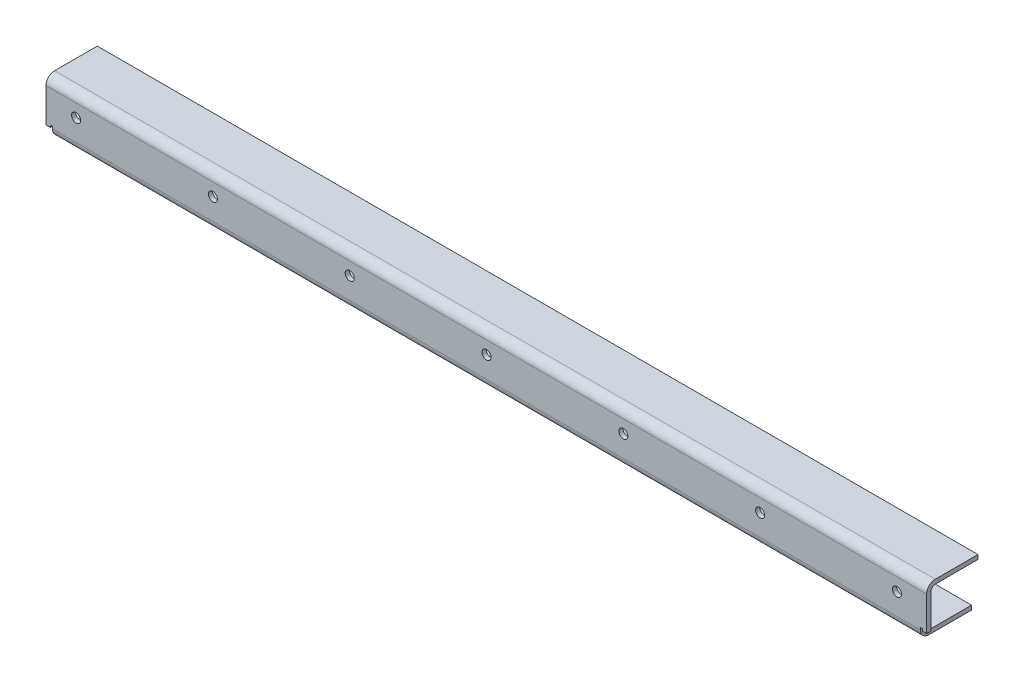
ISO-10303-21;
HEADER;
FILE_DESCRIPTION(('STEP AP214'),'2;1');
FILE_NAME('part.step','',(''),(''),'','','');
FILE_SCHEMA(('AUTOMOTIVE_DESIGN { 1 0 10303 214 1 1 1 1 }'));
ENDSEC;
DATA;
#1=APPLICATION_CONTEXT('core data for automotive mechanical design processes');
#2=APPLICATION_PROTOCOL_DEFINITION('international standard','automotive_design',2000,#1);
#3=PRODUCT_CONTEXT('',#1,'mechanical');
#4=PRODUCT('Part','Part','',(#3));
#5=PRODUCT_RELATED_PRODUCT_CATEGORY('part','',(#4));
#6=PRODUCT_DEFINITION_FORMATION('','',#4);
#7=PRODUCT_DEFINITION_CONTEXT('part definition',#1,'design');
#8=PRODUCT_DEFINITION('design','',#6,#7);
#9=PRODUCT_DEFINITION_SHAPE('','',#8);
#10=(LENGTH_UNIT() NAMED_UNIT(*) SI_UNIT(.MILLI.,.METRE.));
#11=(NAMED_UNIT(*) PLANE_ANGLE_UNIT() SI_UNIT($,.RADIAN.));
#12=(NAMED_UNIT(*) SI_UNIT($,.STERADIAN.) SOLID_ANGLE_UNIT());
#13=UNCERTAINTY_MEASURE_WITH_UNIT(LENGTH_MEASURE(1.E-05),#10,'distance_accuracy_value','');
#14=(GEOMETRIC_REPRESENTATION_CONTEXT(3) GLOBAL_UNCERTAINTY_ASSIGNED_CONTEXT((#13)) GLOBAL_UNIT_ASSIGNED_CONTEXT((#10,
#11,#12)) REPRESENTATION_CONTEXT('',''));
#15=CARTESIAN_POINT('',(0.,0.,0.));
#16=DIRECTION('',(0.,0.,1.));
#17=DIRECTION('',(1.,0.,0.));
#18=AXIS2_PLACEMENT_3D('',#15,#16,#17);
#19=CARTESIAN_POINT('',(0.,0.,0.));
#20=DIRECTION('',(0.,1.,0.));
#21=DIRECTION('',(0.,0.,1.));
#22=AXIS2_PLACEMENT_3D('',#19,#20,#21);
#23=PLANE('',#22);
#24=DIRECTION('',(0.,0.,1.));
#25=VECTOR('',#24,1.);
#26=CARTESIAN_POINT('',(4.7625,0.,-38.1));
#27=LINE('',#26,#25);
#28=CARTESIAN_POINT('',(4.7625,0.,-6.34999999999997));
#29=VERTEX_POINT('',#28);
#30=CARTESIAN_POINT('',(4.7625,0.,-38.0999999999997));
#31=VERTEX_POINT('',#30);
#32=EDGE_CURVE('E160',#29,#31,#27,.F.);
#33=ORIENTED_EDGE('',*,*,#32,.T.);
#34=DIRECTION('',(1.,0.,0.));
#35=VECTOR('',#34,1.);
#36=CARTESIAN_POINT('',(649.2875,-1.24900090270328E-13,-38.0999999999995));
#37=LINE('',#36,#35);
#38=CARTESIAN_POINT('',(649.2875,-1.24900090270329E-13,-38.0999999999998));
#39=VERTEX_POINT('',#38);
#40=EDGE_CURVE('E182',#31,#39,#37,.T.);
#41=ORIENTED_EDGE('',*,*,#40,.T.);
#42=DIRECTION('',(0.,0.,1.));
#43=VECTOR('',#42,1.);
#44=CARTESIAN_POINT('',(649.2875,-1.2490009027033E-13,-3.17499999999949));
#45=LINE('',#44,#43);
#46=CARTESIAN_POINT('',(649.2875,0.,-6.34999999999969));
#47=VERTEX_POINT('',#46);
#48=EDGE_CURVE('E163',#39,#47,#45,.T.);
#49=ORIENTED_EDGE('',*,*,#48,.T.);
#50=DIRECTION('',(-1.,0.,0.));
#51=VECTOR('',#50,1.);
#52=CARTESIAN_POINT('',(4.7625,0.,-6.34999999999997));
#53=LINE('',#52,#51);
#54=EDGE_CURVE('E157',#29,#47,#53,.F.);
#55=ORIENTED_EDGE('',*,*,#54,.F.);
#56=EDGE_LOOP('',(#33,#41,#49,#55));
#57=FACE_BOUND('',#56,.T.);
#58=ADVANCED_FACE('F17',(#57),#23,.F.);
#59=CARTESIAN_POINT('',(3.17499999999997,7.9375,-3.17499999999992));
#60=DIRECTION('',(0.,-1.,0.));
#61=DIRECTION('',(1.,0.,0.));
#62=AXIS2_PLACEMENT_3D('',#59,#60,#61);
#63=PLANE('',#62);
#64=DIRECTION('',(0.,0.,1.));
#65=VECTOR('',#64,1.);
#66=CARTESIAN_POINT('',(3.17499999999997,7.9375,-3.17500000000005));
#67=LINE('',#66,#65);
#68=CARTESIAN_POINT('',(3.17499999999997,7.9375,-3.17499999999992));
#69=VERTEX_POINT('',#68);
#70=CARTESIAN_POINT('',(3.17499999999997,7.93749999999999,0.));
#71=VERTEX_POINT('',#70);
#72=EDGE_CURVE('E167',#69,#71,#67,.T.);
#73=ORIENTED_EDGE('',*,*,#72,.F.);
#74=DIRECTION('',(1.,0.,0.));
#75=VECTOR('',#74,1.);
#76=CARTESIAN_POINT('',(3.17499999999997,7.9375,-3.17499999999992));
#77=LINE('',#76,#75);
#78=CARTESIAN_POINT('',(4.7625,7.93749999999998,-3.17499999999994));
#79=VERTEX_POINT('',#78);
#80=EDGE_CURVE('E199',#69,#79,#77,.T.);
#81=ORIENTED_EDGE('',*,*,#80,.T.);
#82=DIRECTION('',(0.,0.,1.));
#83=VECTOR('',#82,1.);
#84=CARTESIAN_POINT('',(4.7625,7.93749999999997,-3.17499999999992));
#85=LINE('',#84,#83);
#86=CARTESIAN_POINT('',(4.7625,7.93749999999998,0.));
#87=VERTEX_POINT('',#86);
#88=EDGE_CURVE('E184',#87,#79,#85,.F.);
#89=ORIENTED_EDGE('',*,*,#88,.F.);
#90=DIRECTION('',(1.,0.,0.));
#91=VECTOR('',#90,1.);
#92=CARTESIAN_POINT('',(3.17499999999997,7.9375,0.));
#93=LINE('',#92,#91);
#94=EDGE_CURVE('E210',#87,#71,#93,.F.);
#95=ORIENTED_EDGE('',*,*,#94,.T.);
#96=EDGE_LOOP('',(#73,#81,#89,#95));
#97=FACE_BOUND('',#96,.T.);
#98=ADVANCED_FACE('F578',(#97),#63,.T.);
#99=CARTESIAN_POINT('',(649.2875,7.9375,-3.17499999999992));
#100=DIRECTION('',(0.,-1.,0.));
#101=DIRECTION('',(1.,0.,0.));
#102=AXIS2_PLACEMENT_3D('',#99,#100,#101);
#103=PLANE('',#102);
#104=DIRECTION('',(0.,0.,1.));
#105=VECTOR('',#104,1.);
#106=CARTESIAN_POINT('',(649.2875,7.9375,-3.17500000000005));
#107=LINE('',#106,#105);
#108=CARTESIAN_POINT('',(649.2875,7.9375,-3.17500000000001));
#109=VERTEX_POINT('',#108);
#110=CARTESIAN_POINT('',(649.2875,7.9375,0.));
#111=VERTEX_POINT('',#110);
#112=EDGE_CURVE('E216',#109,#111,#107,.T.);
#113=ORIENTED_EDGE('',*,*,#112,.F.);
#114=DIRECTION('',(1.,0.,0.));
#115=VECTOR('',#114,1.);
#116=CARTESIAN_POINT('',(649.2875,7.9375,-3.17499999999992));
#117=LINE('',#116,#115);
#118=CARTESIAN_POINT('',(650.875,7.93749999999998,-3.17499999999992));
#119=VERTEX_POINT('',#118);
#120=EDGE_CURVE('E194',#109,#119,#117,.T.);
#121=ORIENTED_EDGE('',*,*,#120,.T.);
#122=DIRECTION('',(0.,0.,1.));
#123=VECTOR('',#122,1.);
#124=CARTESIAN_POINT('',(650.875,7.93749999999997,-3.17499999999992));
#125=LINE('',#124,#123);
#126=CARTESIAN_POINT('',(650.875,7.93749999999998,0.));
#127=VERTEX_POINT('',#126);
#128=EDGE_CURVE('E206',#127,#119,#125,.F.);
#129=ORIENTED_EDGE('',*,*,#128,.F.);
#130=DIRECTION('',(1.,0.,0.));
#131=VECTOR('',#130,1.);
#132=CARTESIAN_POINT('',(649.2875,7.9375,0.));
#133=LINE('',#132,#131);
#134=EDGE_CURVE('E197',#127,#111,#133,.F.);
#135=ORIENTED_EDGE('',*,*,#134,.T.);
#136=EDGE_LOOP('',(#113,#121,#129,#135));
#137=FACE_BOUND('',#136,.T.);
#138=ADVANCED_FACE('F479',(#137),#103,.T.);
#139=CARTESIAN_POINT('',(649.2875,-1.2490009027033E-13,-38.0999999999995));
#140=DIRECTION('',(0.,0.,1.));
#141=DIRECTION('',(0.,-1.,0.));
#142=AXIS2_PLACEMENT_3D('',#139,#140,#141);
#143=PLANE('',#142);
#144=DIRECTION('',(0.,-1.,0.));
#145=VECTOR('',#144,1.);
#146=CARTESIAN_POINT('',(649.2875,0.,-38.1));
#147=LINE('',#146,#145);
#148=CARTESIAN_POINT('',(649.2875,3.17499999999987,-38.1));
#149=VERTEX_POINT('',#148);
#150=EDGE_CURVE('E223',#149,#39,#147,.T.);
#151=ORIENTED_EDGE('',*,*,#150,.T.);
#152=ORIENTED_EDGE('',*,*,#40,.F.);
#153=DIRECTION('',(0.,-1.,0.));
#154=VECTOR('',#153,1.);
#155=CARTESIAN_POINT('',(4.7625,-1.2490009027033E-13,-38.0999999999995));
#156=LINE('',#155,#154);
#157=CARTESIAN_POINT('',(4.7625,3.17499999999987,-38.0999999999998));
#158=VERTEX_POINT('',#157);
#159=EDGE_CURVE('E178',#158,#31,#156,.T.);
#160=ORIENTED_EDGE('',*,*,#159,.F.);
#161=DIRECTION('',(1.,0.,0.));
#162=VECTOR('',#161,1.);
#163=CARTESIAN_POINT('',(0.,3.17499999999987,-38.1));
#164=LINE('',#163,#162);
#165=EDGE_CURVE('E296',#149,#158,#164,.F.);
#166=ORIENTED_EDGE('',*,*,#165,.F.);
#167=EDGE_LOOP('',(#151,#152,#160,#166));
#168=FACE_BOUND('',#167,.T.);
#169=ADVANCED_FACE('F589',(#168),#143,.F.);
#170=CARTESIAN_POINT('',(4.7625,6.34999999999997,-6.34999999999997));
#171=DIRECTION('',(-1.,0.,0.));
#172=DIRECTION('',(0.,-1.,0.));
#173=AXIS2_PLACEMENT_3D('',#170,#171,#172);
#174=CYLINDRICAL_SURFACE('',#173,6.35);
#175=ORIENTED_EDGE('',*,*,#54,.T.);
#176=CARTESIAN_POINT('',(649.2875,6.34999999999997,-6.34999999999997));
#177=DIRECTION('',(-1.,0.,0.));
#178=DIRECTION('',(0.,-1.,0.));
#179=AXIS2_PLACEMENT_3D('',#176,#177,#178);
#180=CIRCLE('',#179,6.35);
#181=CARTESIAN_POINT('',(649.2875,6.34999999999997,0.));
#182=VERTEX_POINT('',#181);
#183=EDGE_CURVE('E294',#182,#47,#180,.F.);
#184=ORIENTED_EDGE('',*,*,#183,.F.);
#185=DIRECTION('',(-1.,0.,0.));
#186=VECTOR('',#185,1.);
#187=CARTESIAN_POINT('',(0.,6.34999999999997,0.));
#188=LINE('',#187,#186);
#189=CARTESIAN_POINT('',(4.7625,6.34999999999997,0.));
#190=VERTEX_POINT('',#189);
#191=EDGE_CURVE('E172',#182,#190,#188,.T.);
#192=ORIENTED_EDGE('',*,*,#191,.T.);
#193=CARTESIAN_POINT('',(4.7625,6.34999999999997,-6.34999999999997));
#194=DIRECTION('',(-1.,0.,0.));
#195=DIRECTION('',(0.,-1.,0.));
#196=AXIS2_PLACEMENT_3D('',#193,#194,#195);
#197=CIRCLE('',#196,6.35);
#198=EDGE_CURVE('E20',#190,#29,#197,.F.);
#199=ORIENTED_EDGE('',*,*,#198,.T.);
#200=EDGE_LOOP('',(#175,#184,#192,#199));
#201=FACE_BOUND('',#200,.T.);
#202=ADVANCED_FACE('F171',(#201),#174,.T.);
#203=CARTESIAN_POINT('',(3.17499999999997,0.,-3.17500000000005));
#204=DIRECTION('',(1.,0.,0.));
#205=DIRECTION('',(0.,1.,0.));
#206=AXIS2_PLACEMENT_3D('',#203,#204,#205);
#207=PLANE('',#206);
#208=DIRECTION('',(0.,0.,1.));
#209=VECTOR('',#208,1.);
#210=CARTESIAN_POINT('',(3.17499999999997,6.34999999999997,-3.17499999999992));
#211=LINE('',#210,#209);
#212=CARTESIAN_POINT('',(3.17499999999997,6.34999999999997,-3.17500000000001));
#213=VERTEX_POINT('',#212);
#214=CARTESIAN_POINT('',(3.17499999999997,6.34999999999997,0.));
#215=VERTEX_POINT('',#214);
#216=EDGE_CURVE('E343',#213,#215,#211,.T.);
#217=ORIENTED_EDGE('',*,*,#216,.F.);
#218=DIRECTION('',(0.,1.,0.));
#219=VECTOR('',#218,1.);
#220=CARTESIAN_POINT('',(3.17499999999997,0.,-3.17499999999992));
#221=LINE('',#220,#219);
#222=EDGE_CURVE('E331',#213,#69,#221,.T.);
#223=ORIENTED_EDGE('',*,*,#222,.T.);
#224=ORIENTED_EDGE('',*,*,#72,.T.);
#225=DIRECTION('',(0.,1.,0.));
#226=VECTOR('',#225,1.);
#227=CARTESIAN_POINT('',(3.17499999999997,0.,0.));
#228=LINE('',#227,#226);
#229=EDGE_CURVE('E325',#71,#215,#228,.F.);
#230=ORIENTED_EDGE('',*,*,#229,.T.);
#231=EDGE_LOOP('',(#217,#223,#224,#230));
#232=FACE_BOUND('',#231,.T.);
#233=ADVANCED_FACE('F581',(#232),#207,.T.);
#234=CARTESIAN_POINT('',(650.875,7.9375,-3.17499999999992));
#235=DIRECTION('',(-1.,0.,0.));
#236=DIRECTION('',(0.,-1.,0.));
#237=AXIS2_PLACEMENT_3D('',#234,#235,#236);
#238=PLANE('',#237);
#239=ORIENTED_EDGE('',*,*,#128,.T.);
#240=DIRECTION('',(0.,-1.,0.));
#241=VECTOR('',#240,1.);
#242=CARTESIAN_POINT('',(650.875,7.9375,-3.17499999999992));
#243=LINE('',#242,#241);
#244=CARTESIAN_POINT('',(650.875,6.34999999999997,-3.17499999999999));
#245=VERTEX_POINT('',#244);
#246=EDGE_CURVE('E175',#119,#245,#243,.T.);
#247=ORIENTED_EDGE('',*,*,#246,.T.);
#248=DIRECTION('',(0.,0.,1.));
#249=VECTOR('',#248,1.);
#250=CARTESIAN_POINT('',(650.875,6.34999999999997,-3.17500000000005));
#251=LINE('',#250,#249);
#252=CARTESIAN_POINT('',(650.875,6.34999999999997,0.));
#253=VERTEX_POINT('',#252);
#254=EDGE_CURVE('E346',#253,#245,#251,.F.);
#255=ORIENTED_EDGE('',*,*,#254,.F.);
#256=DIRECTION('',(0.,1.,0.));
#257=VECTOR('',#256,1.);
#258=CARTESIAN_POINT('',(650.875,0.,0.));
#259=LINE('',#258,#257);
#260=EDGE_CURVE('E295',#253,#127,#259,.T.);
#261=ORIENTED_EDGE('',*,*,#260,.T.);
#262=EDGE_LOOP('',(#239,#247,#255,#261));
#263=FACE_BOUND('',#262,.T.);
#264=ADVANCED_FACE('F475',(#263),#238,.T.);
#265=CARTESIAN_POINT('',(4.7625,6.34999999999997,-6.34999999999997));
#266=DIRECTION('',(1.,0.,0.));
#267=DIRECTION('',(0.,1.,0.));
#268=AXIS2_PLACEMENT_3D('',#265,#266,#267);
#269=PLANE('',#268);
#270=CARTESIAN_POINT('',(4.7625,6.34999999999997,-6.34999999999997));
#271=DIRECTION('',(-1.,0.,0.));
#272=DIRECTION('',(0.,-1.,0.));
#273=AXIS2_PLACEMENT_3D('',#270,#271,#272);
#274=CIRCLE('',#273,3.175);
#275=CARTESIAN_POINT('',(4.7625,6.34999999999997,-3.17499999999999));
#276=VERTEX_POINT('',#275);
#277=CARTESIAN_POINT('',(4.7625,3.17499999999998,-6.34999999999997));
#278=VERTEX_POINT('',#277);
#279=EDGE_CURVE('E292',#276,#278,#274,.F.);
#280=ORIENTED_EDGE('',*,*,#279,.T.);
#281=DIRECTION('',(0.,0.,1.));
#282=VECTOR('',#281,1.);
#283=CARTESIAN_POINT('',(4.7625,3.175,0.));
#284=LINE('',#283,#282);
#285=EDGE_CURVE('E174',#158,#278,#284,.T.);
#286=ORIENTED_EDGE('',*,*,#285,.F.);
#287=ORIENTED_EDGE('',*,*,#159,.T.);
#288=ORIENTED_EDGE('',*,*,#32,.F.);
#289=ORIENTED_EDGE('',*,*,#198,.F.);
#290=DIRECTION('',(0.,-1.,0.));
#291=VECTOR('',#290,1.);
#292=CARTESIAN_POINT('',(4.7625,7.9375,0.));
#293=LINE('',#292,#291);
#294=EDGE_CURVE('E152',#190,#87,#293,.F.);
#295=ORIENTED_EDGE('',*,*,#294,.T.);
#296=ORIENTED_EDGE('',*,*,#88,.T.);
#297=DIRECTION('',(0.,-1.,0.));
#298=VECTOR('',#297,1.);
#299=CARTESIAN_POINT('',(4.7625,7.9375,-3.17499999999992));
#300=LINE('',#299,#298);
#301=EDGE_CURVE('E180',#79,#276,#300,.T.);
#302=ORIENTED_EDGE('',*,*,#301,.T.);
#303=EDGE_LOOP('',(#280,#286,#287,#288,#289,#295,#296,#302));
#304=FACE_BOUND('',#303,.T.);
#305=ADVANCED_FACE('F176',(#304),#269,.F.);
#306=CARTESIAN_POINT('',(0.,3.175,0.));
#307=DIRECTION('',(0.,1.,0.));
#308=DIRECTION('',(0.,0.,1.));
#309=AXIS2_PLACEMENT_3D('',#306,#307,#308);
#310=PLANE('',#309);
#311=DIRECTION('',(0.,0.,1.));
#312=VECTOR('',#311,1.);
#313=CARTESIAN_POINT('',(649.2875,3.175,0.));
#314=LINE('',#313,#312);
#315=CARTESIAN_POINT('',(649.2875,3.17499999999998,-6.34999999999969));
#316=VERTEX_POINT('',#315);
#317=EDGE_CURVE('E301',#316,#149,#314,.F.);
#318=ORIENTED_EDGE('',*,*,#317,.T.);
#319=ORIENTED_EDGE('',*,*,#165,.T.);
#320=ORIENTED_EDGE('',*,*,#285,.T.);
#321=DIRECTION('',(-1.,0.,0.));
#322=VECTOR('',#321,1.);
#323=CARTESIAN_POINT('',(4.7625,3.17499999999997,-6.34999999999997));
#324=LINE('',#323,#322);
#325=EDGE_CURVE('E291',#278,#316,#324,.F.);
#326=ORIENTED_EDGE('',*,*,#325,.T.);
#327=EDGE_LOOP('',(#318,#319,#320,#326));
#328=FACE_BOUND('',#327,.T.);
#329=ADVANCED_FACE('F489',(#328),#310,.T.);
#330=CARTESIAN_POINT('',(649.2875,6.34999999999997,-6.34999999999997));
#331=DIRECTION('',(1.,0.,0.));
#332=DIRECTION('',(0.,1.,0.));
#333=AXIS2_PLACEMENT_3D('',#330,#331,#332);
#334=PLANE('',#333);
#335=CARTESIAN_POINT('',(649.2875,6.34999999999997,-6.34999999999997));
#336=DIRECTION('',(-1.,0.,0.));
#337=DIRECTION('',(0.,-1.,0.));
#338=AXIS2_PLACEMENT_3D('',#335,#336,#337);
#339=CIRCLE('',#338,3.175);
#340=CARTESIAN_POINT('',(649.2875,6.34999999999997,-3.17500000000001));
#341=VERTEX_POINT('',#340);
#342=EDGE_CURVE('E288',#316,#341,#339,.T.);
#343=ORIENTED_EDGE('',*,*,#342,.T.);
#344=DIRECTION('',(0.,1.,0.));
#345=VECTOR('',#344,1.);
#346=CARTESIAN_POINT('',(649.2875,6.34999999999997,-3.17500000000005));
#347=LINE('',#346,#345);
#348=EDGE_CURVE('E168',#341,#109,#347,.T.);
#349=ORIENTED_EDGE('',*,*,#348,.T.);
#350=ORIENTED_EDGE('',*,*,#112,.T.);
#351=DIRECTION('',(0.,1.,0.));
#352=VECTOR('',#351,1.);
#353=CARTESIAN_POINT('',(649.2875,6.34999999999997,0.));
#354=LINE('',#353,#352);
#355=EDGE_CURVE('E219',#111,#182,#354,.F.);
#356=ORIENTED_EDGE('',*,*,#355,.T.);
#357=ORIENTED_EDGE('',*,*,#183,.T.);
#358=ORIENTED_EDGE('',*,*,#48,.F.);
#359=ORIENTED_EDGE('',*,*,#150,.F.);
#360=ORIENTED_EDGE('',*,*,#317,.F.);
#361=EDGE_LOOP('',(#343,#349,#350,#356,#357,#358,#359,#360));
#362=FACE_BOUND('',#361,.T.);
#363=ADVANCED_FACE('F484',(#362),#334,.T.);
#364=CARTESIAN_POINT('',(0.,0.,0.));
#365=DIRECTION('',(0.,0.,-1.));
#366=DIRECTION('',(-1.,0.,0.));
#367=AXIS2_PLACEMENT_3D('',#364,#365,#366);
#368=PLANE('',#367);
#369=CARTESIAN_POINT('',(22.352,22.225,0.));
#370=DIRECTION('',(0.,0.,1.));
#371=DIRECTION('',(1.,0.,0.));
#372=AXIS2_PLACEMENT_3D('',#369,#370,#371);
#373=CIRCLE('',#372,3.3734375);
#374=CARTESIAN_POINT('',(25.7254375,22.225,0.));
#375=VERTEX_POINT('',#374);
#376=EDGE_CURVE('E266',#375,#375,#373,.F.);
#377=ORIENTED_EDGE('',*,*,#376,.T.);
#378=EDGE_LOOP('',(#377));
#379=FACE_BOUND('',#378,.T.);
#380=CARTESIAN_POINT('',(123.952,22.225,5.55111512312578E-13));
#381=DIRECTION('',(0.,0.,1.));
#382=DIRECTION('',(1.,0.,0.));
#383=AXIS2_PLACEMENT_3D('',#380,#381,#382);
#384=CIRCLE('',#383,3.3734375);
#385=CARTESIAN_POINT('',(127.3254375,22.225,5.55111512312578E-13));
#386=VERTEX_POINT('',#385);
#387=EDGE_CURVE('E270',#386,#386,#384,.F.);
#388=ORIENTED_EDGE('',*,*,#387,.T.);
#389=EDGE_LOOP('',(#388));
#390=FACE_BOUND('',#389,.T.);
#391=CARTESIAN_POINT('',(631.952,22.225,0.));
#392=DIRECTION('',(0.,0.,1.));
#393=DIRECTION('',(1.,0.,0.));
#394=AXIS2_PLACEMENT_3D('',#391,#392,#393);
#395=CIRCLE('',#394,3.37343749999997);
#396=CARTESIAN_POINT('',(635.3254375,22.225,0.));
#397=VERTEX_POINT('',#396);
#398=EDGE_CURVE('E273',#397,#397,#395,.F.);
#399=ORIENTED_EDGE('',*,*,#398,.T.);
#400=EDGE_LOOP('',(#399));
#401=FACE_BOUND('',#400,.T.);
#402=CARTESIAN_POINT('',(530.352,22.225,0.));
#403=DIRECTION('',(0.,0.,1.));
#404=DIRECTION('',(1.,0.,0.));
#405=AXIS2_PLACEMENT_3D('',#402,#403,#404);
#406=CIRCLE('',#405,3.37343749999997);
#407=CARTESIAN_POINT('',(533.7254375,22.225,0.));
#408=VERTEX_POINT('',#407);
#409=EDGE_CURVE('E276',#408,#408,#406,.F.);
#410=ORIENTED_EDGE('',*,*,#409,.T.);
#411=EDGE_LOOP('',(#410));
#412=FACE_BOUND('',#411,.T.);
#413=CARTESIAN_POINT('',(428.752,22.225,5.55111512312578E-13));
#414=DIRECTION('',(0.,0.,1.));
#415=DIRECTION('',(1.,0.,0.));
#416=AXIS2_PLACEMENT_3D('',#413,#414,#415);
#417=CIRCLE('',#416,3.37343750000003);
#418=CARTESIAN_POINT('',(432.1254375,22.225,5.55111512312578E-13));
#419=VERTEX_POINT('',#418);
#420=EDGE_CURVE('E279',#419,#419,#417,.F.);
#421=ORIENTED_EDGE('',*,*,#420,.T.);
#422=EDGE_LOOP('',(#421));
#423=FACE_BOUND('',#422,.T.);
#424=CARTESIAN_POINT('',(327.152,22.225,5.55111512312578E-13));
#425=DIRECTION('',(0.,0.,1.));
#426=DIRECTION('',(1.,0.,0.));
#427=AXIS2_PLACEMENT_3D('',#424,#425,#426);
#428=CIRCLE('',#427,3.37343750000003);
#429=CARTESIAN_POINT('',(330.5254375,22.225,5.55111512312578E-13));
#430=VERTEX_POINT('',#429);
#431=EDGE_CURVE('E282',#430,#430,#428,.F.);
#432=ORIENTED_EDGE('',*,*,#431,.T.);
#433=EDGE_LOOP('',(#432));
#434=FACE_BOUND('',#433,.T.);
#435=CARTESIAN_POINT('',(225.552,22.225,5.55111512312578E-13));
#436=DIRECTION('',(0.,0.,1.));
#437=DIRECTION('',(1.,0.,0.));
#438=AXIS2_PLACEMENT_3D('',#435,#436,#437);
#439=CIRCLE('',#438,3.3734375);
#440=CARTESIAN_POINT('',(228.9254375,22.225,5.55111512312578E-13));
#441=VERTEX_POINT('',#440);
#442=EDGE_CURVE('E285',#441,#441,#439,.F.);
#443=ORIENTED_EDGE('',*,*,#442,.T.);
#444=EDGE_LOOP('',(#443));
#445=FACE_BOUND('',#444,.T.);
#446=ORIENTED_EDGE('',*,*,#94,.F.);
#447=ORIENTED_EDGE('',*,*,#294,.F.);
#448=ORIENTED_EDGE('',*,*,#191,.F.);
#449=ORIENTED_EDGE('',*,*,#355,.F.);
#450=ORIENTED_EDGE('',*,*,#134,.F.);
#451=ORIENTED_EDGE('',*,*,#260,.F.);
#452=DIRECTION('',(1.,0.,0.));
#453=VECTOR('',#452,1.);
#454=CARTESIAN_POINT('',(654.05,6.34999999999997,0.));
#455=LINE('',#454,#453);
#456=CARTESIAN_POINT('',(654.05,6.34999999999997,1.85037170770859E-13));
#457=VERTEX_POINT('',#456);
#458=EDGE_CURVE('E349',#457,#253,#455,.F.);
#459=ORIENTED_EDGE('',*,*,#458,.F.);
#460=DIRECTION('',(0.,1.,0.));
#461=VECTOR('',#460,1.);
#462=CARTESIAN_POINT('',(654.05,6.34999999999997,5.55111512312578E-13));
#463=LINE('',#462,#461);
#464=CARTESIAN_POINT('',(654.049999999999,31.75,5.37113756249319E-13));
#465=VERTEX_POINT('',#464);
#466=EDGE_CURVE('E356',#465,#457,#463,.F.);
#467=ORIENTED_EDGE('',*,*,#466,.F.);
#468=DIRECTION('',(1.,0.,0.));
#469=VECTOR('',#468,1.);
#470=CARTESIAN_POINT('',(654.049999999997,31.75,4.83120488059541E-13));
#471=LINE('',#470,#469);
#472=CARTESIAN_POINT('',(0.,31.75,2.4156024402977E-13));
#473=VERTEX_POINT('',#472);
#474=EDGE_CURVE('E265',#473,#465,#471,.T.);
#475=ORIENTED_EDGE('',*,*,#474,.F.);
#476=DIRECTION('',(0.,-1.,0.));
#477=VECTOR('',#476,1.);
#478=CARTESIAN_POINT('',(0.,6.34999999999997,0.));
#479=LINE('',#478,#477);
#480=CARTESIAN_POINT('',(0.,6.34999999999997,0.));
#481=VERTEX_POINT('',#480);
#482=EDGE_CURVE('E388',#481,#473,#479,.F.);
#483=ORIENTED_EDGE('',*,*,#482,.F.);
#484=DIRECTION('',(1.,0.,0.));
#485=VECTOR('',#484,1.);
#486=CARTESIAN_POINT('',(4.7625,6.34999999999997,0.));
#487=LINE('',#486,#485);
#488=EDGE_CURVE('E369',#215,#481,#487,.F.);
#489=ORIENTED_EDGE('',*,*,#488,.F.);
#490=ORIENTED_EDGE('',*,*,#229,.F.);
#491=EDGE_LOOP('',(#446,#447,#448,#449,#450,#451,#459,#467,#475,#483,#489,#490));
#492=FACE_BOUND('',#491,.T.);
#493=ADVANCED_FACE('F497',(#379,#390,#401,#412,#423,#434,#445,#492),#368,.F.);
#494=CARTESIAN_POINT('',(4.7625,6.34999999999997,-3.17499999999992));
#495=DIRECTION('',(0.,-1.,0.));
#496=DIRECTION('',(1.,0.,0.));
#497=AXIS2_PLACEMENT_3D('',#494,#495,#496);
#498=PLANE('',#497);
#499=ORIENTED_EDGE('',*,*,#488,.T.);
#500=DIRECTION('',(0.,0.,1.));
#501=VECTOR('',#500,1.);
#502=CARTESIAN_POINT('',(0.,6.34999999999997,-3.17499999999992));
#503=LINE('',#502,#501);
#504=CARTESIAN_POINT('',(0.,6.34999999999997,-3.17500000000005));
#505=VERTEX_POINT('',#504);
#506=EDGE_CURVE('E269',#505,#481,#503,.T.);
#507=ORIENTED_EDGE('',*,*,#506,.F.);
#508=DIRECTION('',(-1.,0.,0.));
#509=VECTOR('',#508,1.);
#510=CARTESIAN_POINT('',(0.,6.34999999999997,-3.17500000000005));
#511=LINE('',#510,#509);
#512=EDGE_CURVE('E264',#213,#505,#511,.T.);
#513=ORIENTED_EDGE('',*,*,#512,.F.);
#514=ORIENTED_EDGE('',*,*,#216,.T.);
#515=EDGE_LOOP('',(#499,#507,#513,#514));
#516=FACE_BOUND('',#515,.T.);
#517=ADVANCED_FACE('F552',(#516),#498,.T.);
#518=CARTESIAN_POINT('',(654.05,6.34999999999997,-3.17500000000005));
#519=DIRECTION('',(0.,-1.,0.));
#520=DIRECTION('',(1.,0.,0.));
#521=AXIS2_PLACEMENT_3D('',#518,#519,#520);
#522=PLANE('',#521);
#523=DIRECTION('',(-1.,0.,0.));
#524=VECTOR('',#523,1.);
#525=CARTESIAN_POINT('',(0.,6.34999999999997,-3.17500000000005));
#526=LINE('',#525,#524);
#527=CARTESIAN_POINT('',(654.05,6.34999999999997,-3.17500000000005));
#528=VERTEX_POINT('',#527);
#529=EDGE_CURVE('E364',#528,#245,#526,.T.);
#530=ORIENTED_EDGE('',*,*,#529,.F.);
#531=DIRECTION('',(0.,0.,1.));
#532=VECTOR('',#531,1.);
#533=CARTESIAN_POINT('',(654.05,6.34999999999997,-3.17500000000005));
#534=LINE('',#533,#532);
#535=EDGE_CURVE('E293',#528,#457,#534,.T.);
#536=ORIENTED_EDGE('',*,*,#535,.T.);
#537=ORIENTED_EDGE('',*,*,#458,.T.);
#538=ORIENTED_EDGE('',*,*,#254,.T.);
#539=EDGE_LOOP('',(#530,#536,#537,#538));
#540=FACE_BOUND('',#539,.T.);
#541=ADVANCED_FACE('F472',(#540),#522,.T.);
#542=CARTESIAN_POINT('',(4.7625,6.34999999999997,-6.34999999999997));
#543=DIRECTION('',(-1.,0.,0.));
#544=DIRECTION('',(0.,-1.,0.));
#545=AXIS2_PLACEMENT_3D('',#542,#543,#544);
#546=CYLINDRICAL_SURFACE('',#545,3.175);
#547=ORIENTED_EDGE('',*,*,#342,.F.);
#548=ORIENTED_EDGE('',*,*,#325,.F.);
#549=ORIENTED_EDGE('',*,*,#279,.F.);
#550=DIRECTION('',(-1.,0.,0.));
#551=VECTOR('',#550,1.);
#552=CARTESIAN_POINT('',(0.,6.34999999999997,-3.17500000000005));
#553=LINE('',#552,#551);
#554=EDGE_CURVE('E261',#341,#276,#553,.T.);
#555=ORIENTED_EDGE('',*,*,#554,.F.);
#556=EDGE_LOOP('',(#547,#548,#549,#555));
#557=FACE_BOUND('',#556,.T.);
#558=ADVANCED_FACE('F488',(#557),#546,.F.);
#559=CARTESIAN_POINT('',(225.552,22.225,5.55111512312578E-13));
#560=DIRECTION('',(0.,0.,1.));
#561=DIRECTION('',(1.,0.,0.));
#562=AXIS2_PLACEMENT_3D('',#559,#560,#561);
#563=CYLINDRICAL_SURFACE('',#562,3.3734375);
#564=ORIENTED_EDGE('',*,*,#442,.F.);
#565=EDGE_LOOP('',(#564));
#566=FACE_BOUND('',#565,.T.);
#567=CARTESIAN_POINT('',(225.552,22.225,-3.17499999999949));
#568=DIRECTION('',(0.,0.,1.));
#569=DIRECTION('',(1.,0.,0.));
#570=AXIS2_PLACEMENT_3D('',#567,#568,#569);
#571=CIRCLE('',#570,3.3734375);
#572=CARTESIAN_POINT('',(228.9254375,22.225,-3.17499999999949));
#573=VERTEX_POINT('',#572);
#574=EDGE_CURVE('E258',#573,#573,#571,.T.);
#575=ORIENTED_EDGE('',*,*,#574,.F.);
#576=EDGE_LOOP('',(#575));
#577=FACE_BOUND('',#576,.T.);
#578=ADVANCED_FACE('F543',(#566,#577),#563,.F.);
#579=CARTESIAN_POINT('',(327.152,22.225,5.55111512312578E-13));
#580=DIRECTION('',(0.,0.,1.));
#581=DIRECTION('',(1.,0.,0.));
#582=AXIS2_PLACEMENT_3D('',#579,#580,#581);
#583=CYLINDRICAL_SURFACE('',#582,3.37343750000003);
#584=ORIENTED_EDGE('',*,*,#431,.F.);
#585=EDGE_LOOP('',(#584));
#586=FACE_BOUND('',#585,.T.);
#587=CARTESIAN_POINT('',(327.152,22.225,-3.17499999999949));
#588=DIRECTION('',(0.,0.,1.));
#589=DIRECTION('',(1.,0.,0.));
#590=AXIS2_PLACEMENT_3D('',#587,#588,#589);
#591=CIRCLE('',#590,3.37343750000003);
#592=CARTESIAN_POINT('',(330.5254375,22.225,-3.17499999999949));
#593=VERTEX_POINT('',#592);
#594=EDGE_CURVE('E255',#593,#593,#591,.T.);
#595=ORIENTED_EDGE('',*,*,#594,.F.);
#596=EDGE_LOOP('',(#595));
#597=FACE_BOUND('',#596,.T.);
#598=ADVANCED_FACE('F539',(#586,#597),#583,.F.);
#599=CARTESIAN_POINT('',(428.752,22.225,5.55111512312578E-13));
#600=DIRECTION('',(0.,0.,1.));
#601=DIRECTION('',(1.,0.,0.));
#602=AXIS2_PLACEMENT_3D('',#599,#600,#601);
#603=CYLINDRICAL_SURFACE('',#602,3.37343750000003);
#604=ORIENTED_EDGE('',*,*,#420,.F.);
#605=EDGE_LOOP('',(#604));
#606=FACE_BOUND('',#605,.T.);
#607=CARTESIAN_POINT('',(428.752,22.225,-3.17499999999949));
#608=DIRECTION('',(0.,0.,1.));
#609=DIRECTION('',(1.,0.,0.));
#610=AXIS2_PLACEMENT_3D('',#607,#608,#609);
#611=CIRCLE('',#610,3.37343750000003);
#612=CARTESIAN_POINT('',(432.1254375,22.225,-3.17499999999949));
#613=VERTEX_POINT('',#612);
#614=EDGE_CURVE('E252',#613,#613,#611,.T.);
#615=ORIENTED_EDGE('',*,*,#614,.F.);
#616=EDGE_LOOP('',(#615));
#617=FACE_BOUND('',#616,.T.);
#618=ADVANCED_FACE('F535',(#606,#617),#603,.F.);
#619=CARTESIAN_POINT('',(530.352,22.225,0.));
#620=DIRECTION('',(0.,0.,1.));
#621=DIRECTION('',(1.,0.,0.));
#622=AXIS2_PLACEMENT_3D('',#619,#620,#621);
#623=CYLINDRICAL_SURFACE('',#622,3.37343749999997);
#624=ORIENTED_EDGE('',*,*,#409,.F.);
#625=EDGE_LOOP('',(#624));
#626=FACE_BOUND('',#625,.T.);
#627=CARTESIAN_POINT('',(530.352,22.225,-3.17500000000005));
#628=DIRECTION('',(0.,0.,1.));
#629=DIRECTION('',(1.,0.,0.));
#630=AXIS2_PLACEMENT_3D('',#627,#628,#629);
#631=CIRCLE('',#630,3.37343749999997);
#632=CARTESIAN_POINT('',(533.7254375,22.225,-3.17500000000005));
#633=VERTEX_POINT('',#632);
#634=EDGE_CURVE('E249',#633,#633,#631,.T.);
#635=ORIENTED_EDGE('',*,*,#634,.F.);
#636=EDGE_LOOP('',(#635));
#637=FACE_BOUND('',#636,.T.);
#638=ADVANCED_FACE('F531',(#626,#637),#623,.F.);
#639=CARTESIAN_POINT('',(631.952,22.225,0.));
#640=DIRECTION('',(0.,0.,1.));
#641=DIRECTION('',(1.,0.,0.));
#642=AXIS2_PLACEMENT_3D('',#639,#640,#641);
#643=CYLINDRICAL_SURFACE('',#642,3.37343749999997);
#644=ORIENTED_EDGE('',*,*,#398,.F.);
#645=EDGE_LOOP('',(#644));
#646=FACE_BOUND('',#645,.T.);
#647=CARTESIAN_POINT('',(631.952,22.225,-3.17500000000005));
#648=DIRECTION('',(0.,0.,1.));
#649=DIRECTION('',(1.,0.,0.));
#650=AXIS2_PLACEMENT_3D('',#647,#648,#649);
#651=CIRCLE('',#650,3.37343749999997);
#652=CARTESIAN_POINT('',(635.3254375,22.225,-3.17500000000005));
#653=VERTEX_POINT('',#652);
#654=EDGE_CURVE('E246',#653,#653,#651,.T.);
#655=ORIENTED_EDGE('',*,*,#654,.F.);
#656=EDGE_LOOP('',(#655));
#657=FACE_BOUND('',#656,.T.);
#658=ADVANCED_FACE('F527',(#646,#657),#643,.F.);
#659=CARTESIAN_POINT('',(123.952,22.225,5.55111512312578E-13));
#660=DIRECTION('',(0.,0.,1.));
#661=DIRECTION('',(1.,0.,0.));
#662=AXIS2_PLACEMENT_3D('',#659,#660,#661);
#663=CYLINDRICAL_SURFACE('',#662,3.3734375);
#664=ORIENTED_EDGE('',*,*,#387,.F.);
#665=EDGE_LOOP('',(#664));
#666=FACE_BOUND('',#665,.T.);
#667=CARTESIAN_POINT('',(123.952,22.225,-3.17499999999949));
#668=DIRECTION('',(0.,0.,1.));
#669=DIRECTION('',(1.,0.,0.));
#670=AXIS2_PLACEMENT_3D('',#667,#668,#669);
#671=CIRCLE('',#670,3.3734375);
#672=CARTESIAN_POINT('',(127.3254375,22.225,-3.17499999999949));
#673=VERTEX_POINT('',#672);
#674=EDGE_CURVE('E243',#673,#673,#671,.T.);
#675=ORIENTED_EDGE('',*,*,#674,.F.);
#676=EDGE_LOOP('',(#675));
#677=FACE_BOUND('',#676,.T.);
#678=ADVANCED_FACE('F523',(#666,#677),#663,.F.);
#679=CARTESIAN_POINT('',(22.352,22.225,0.));
#680=DIRECTION('',(0.,0.,1.));
#681=DIRECTION('',(1.,0.,0.));
#682=AXIS2_PLACEMENT_3D('',#679,#680,#681);
#683=CYLINDRICAL_SURFACE('',#682,3.3734375);
#684=ORIENTED_EDGE('',*,*,#376,.F.);
#685=EDGE_LOOP('',(#684));
#686=FACE_BOUND('',#685,.T.);
#687=CARTESIAN_POINT('',(22.352,22.225,-3.17499999999992));
#688=DIRECTION('',(0.,0.,1.));
#689=DIRECTION('',(1.,0.,0.));
#690=AXIS2_PLACEMENT_3D('',#687,#688,#689);
#691=CIRCLE('',#690,3.3734375);
#692=CARTESIAN_POINT('',(25.7254375,22.225,-3.17499999999992));
#693=VERTEX_POINT('',#692);
#694=EDGE_CURVE('E240',#693,#693,#691,.T.);
#695=ORIENTED_EDGE('',*,*,#694,.F.);
#696=EDGE_LOOP('',(#695));
#697=FACE_BOUND('',#696,.T.);
#698=ADVANCED_FACE('F520',(#686,#697),#683,.F.);
#699=CARTESIAN_POINT('',(654.049999999997,31.75,-6.34999999999952));
#700=DIRECTION('',(1.,0.,0.));
#701=DIRECTION('',(0.,1.,0.));
#702=AXIS2_PLACEMENT_3D('',#699,#700,#701);
#703=CYLINDRICAL_SURFACE('',#702,6.35);
#704=DIRECTION('',(1.,0.,0.));
#705=VECTOR('',#704,1.);
#706=CARTESIAN_POINT('',(0.,38.1,-6.34999999999997));
#707=LINE('',#706,#705);
#708=CARTESIAN_POINT('',(654.049999999997,38.1,-6.34999999999969));
#709=VERTEX_POINT('',#708);
#710=CARTESIAN_POINT('',(0.,38.1,-6.34999999999975));
#711=VERTEX_POINT('',#710);
#712=EDGE_CURVE('E239',#709,#711,#707,.F.);
#713=ORIENTED_EDGE('',*,*,#712,.T.);
#714=CARTESIAN_POINT('',(0.,31.75,-6.34999999999952));
#715=DIRECTION('',(1.,0.,0.));
#716=DIRECTION('',(0.,1.,0.));
#717=AXIS2_PLACEMENT_3D('',#714,#715,#716);
#718=CIRCLE('',#717,6.35);
#719=EDGE_CURVE('E236',#473,#711,#718,.F.);
#720=ORIENTED_EDGE('',*,*,#719,.F.);
#721=ORIENTED_EDGE('',*,*,#474,.T.);
#722=CARTESIAN_POINT('',(654.049999999997,31.75,-6.34999999999952));
#723=DIRECTION('',(1.,0.,0.));
#724=DIRECTION('',(0.,1.,0.));
#725=AXIS2_PLACEMENT_3D('',#722,#723,#724);
#726=CIRCLE('',#725,6.35);
#727=EDGE_CURVE('E262',#465,#709,#726,.F.);
#728=ORIENTED_EDGE('',*,*,#727,.T.);
#729=EDGE_LOOP('',(#713,#720,#721,#728));
#730=FACE_BOUND('',#729,.T.);
#731=ADVANCED_FACE('F451',(#730),#703,.T.);
#732=CARTESIAN_POINT('',(0.,0.,-3.17500000000005));
#733=DIRECTION('',(0.,0.,-1.));
#734=DIRECTION('',(-1.,0.,0.));
#735=AXIS2_PLACEMENT_3D('',#732,#733,#734);
#736=PLANE('',#735);
#737=ORIENTED_EDGE('',*,*,#694,.T.);
#738=EDGE_LOOP('',(#737));
#739=FACE_BOUND('',#738,.T.);
#740=ORIENTED_EDGE('',*,*,#674,.T.);
#741=EDGE_LOOP('',(#740));
#742=FACE_BOUND('',#741,.T.);
#743=ORIENTED_EDGE('',*,*,#654,.T.);
#744=EDGE_LOOP('',(#743));
#745=FACE_BOUND('',#744,.T.);
#746=ORIENTED_EDGE('',*,*,#634,.T.);
#747=EDGE_LOOP('',(#746));
#748=FACE_BOUND('',#747,.T.);
#749=ORIENTED_EDGE('',*,*,#614,.T.);
#750=EDGE_LOOP('',(#749));
#751=FACE_BOUND('',#750,.T.);
#752=ORIENTED_EDGE('',*,*,#594,.T.);
#753=EDGE_LOOP('',(#752));
#754=FACE_BOUND('',#753,.T.);
#755=ORIENTED_EDGE('',*,*,#574,.T.);
#756=EDGE_LOOP('',(#755));
#757=FACE_BOUND('',#756,.T.);
#758=ORIENTED_EDGE('',*,*,#554,.T.);
#759=ORIENTED_EDGE('',*,*,#301,.F.);
#760=ORIENTED_EDGE('',*,*,#80,.F.);
#761=ORIENTED_EDGE('',*,*,#222,.F.);
#762=ORIENTED_EDGE('',*,*,#512,.T.);
#763=DIRECTION('',(0.,1.,0.));
#764=VECTOR('',#763,1.);
#765=CARTESIAN_POINT('',(0.,0.,-3.17500000000005));
#766=LINE('',#765,#764);
#767=CARTESIAN_POINT('',(0.,31.75,-3.17499999999978));
#768=VERTEX_POINT('',#767);
#769=EDGE_CURVE('E383',#505,#768,#766,.T.);
#770=ORIENTED_EDGE('',*,*,#769,.T.);
#771=DIRECTION('',(1.,0.,0.));
#772=VECTOR('',#771,1.);
#773=CARTESIAN_POINT('',(654.049999999997,31.75,-3.17499999999952));
#774=LINE('',#773,#772);
#775=CARTESIAN_POINT('',(654.049999999999,31.75,-3.17499999999978));
#776=VERTEX_POINT('',#775);
#777=EDGE_CURVE('E232',#768,#776,#774,.T.);
#778=ORIENTED_EDGE('',*,*,#777,.T.);
#779=DIRECTION('',(0.,1.,0.));
#780=VECTOR('',#779,1.);
#781=CARTESIAN_POINT('',(654.05,0.,-3.17500000000005));
#782=LINE('',#781,#780);
#783=EDGE_CURVE('E397',#776,#528,#782,.F.);
#784=ORIENTED_EDGE('',*,*,#783,.T.);
#785=ORIENTED_EDGE('',*,*,#529,.T.);
#786=ORIENTED_EDGE('',*,*,#246,.F.);
#787=ORIENTED_EDGE('',*,*,#120,.F.);
#788=ORIENTED_EDGE('',*,*,#348,.F.);
#789=EDGE_LOOP('',(#758,#759,#760,#761,#762,#770,#778,#784,#785,#786,#787,#788));
#790=FACE_BOUND('',#789,.T.);
#791=ADVANCED_FACE('F465',(#739,#742,#745,#748,#751,#754,#757,#790),#736,.T.);
#792=CARTESIAN_POINT('',(0.,38.1,2.22044604925031E-13));
#793=DIRECTION('',(0.,-1.,0.));
#794=DIRECTION('',(0.,0.,-1.));
#795=AXIS2_PLACEMENT_3D('',#792,#793,#794);
#796=PLANE('',#795);
#797=DIRECTION('',(0.,0.,1.));
#798=VECTOR('',#797,1.);
#799=CARTESIAN_POINT('',(654.049999999997,38.1,-38.1));
#800=LINE('',#799,#798);
#801=CARTESIAN_POINT('',(654.049999999997,38.1,-38.1));
#802=VERTEX_POINT('',#801);
#803=EDGE_CURVE('E235',#709,#802,#800,.F.);
#804=ORIENTED_EDGE('',*,*,#803,.T.);
#805=DIRECTION('',(1.,0.,0.));
#806=VECTOR('',#805,1.);
#807=CARTESIAN_POINT('',(0.,38.1,-38.1));
#808=LINE('',#807,#806);
#809=CARTESIAN_POINT('',(0.,38.1,-38.1));
#810=VERTEX_POINT('',#809);
#811=EDGE_CURVE('E409',#802,#810,#808,.F.);
#812=ORIENTED_EDGE('',*,*,#811,.T.);
#813=DIRECTION('',(0.,0.,1.));
#814=VECTOR('',#813,1.);
#815=CARTESIAN_POINT('',(0.,38.1,-3.17499999999992));
#816=LINE('',#815,#814);
#817=EDGE_CURVE('E410',#810,#711,#816,.T.);
#818=ORIENTED_EDGE('',*,*,#817,.T.);
#819=ORIENTED_EDGE('',*,*,#712,.F.);
#820=EDGE_LOOP('',(#804,#812,#818,#819));
#821=FACE_BOUND('',#820,.T.);
#822=ADVANCED_FACE('F444',(#821),#796,.F.);
#823=CARTESIAN_POINT('',(654.049999999997,38.1,-38.1));
#824=DIRECTION('',(-1.,0.,0.));
#825=DIRECTION('',(0.,-1.,0.));
#826=AXIS2_PLACEMENT_3D('',#823,#824,#825);
#827=PLANE('',#826);
#828=DIRECTION('',(0.,0.,-1.));
#829=VECTOR('',#828,1.);
#830=CARTESIAN_POINT('',(654.049999999997,34.925,1.11022302462516E-13));
#831=LINE('',#830,#829);
#832=CARTESIAN_POINT('',(654.049999999997,34.925,-38.1));
#833=VERTEX_POINT('',#832);
#834=CARTESIAN_POINT('',(654.049999999999,34.925,-6.34999999999946));
#835=VERTEX_POINT('',#834);
#836=EDGE_CURVE('E414',#833,#835,#831,.F.);
#837=ORIENTED_EDGE('',*,*,#836,.F.);
#838=DIRECTION('',(0.,-1.,0.));
#839=VECTOR('',#838,1.);
#840=CARTESIAN_POINT('',(654.049999999997,38.1,-38.1));
#841=LINE('',#840,#839);
#842=EDGE_CURVE('E406',#833,#802,#841,.F.);
#843=ORIENTED_EDGE('',*,*,#842,.T.);
#844=ORIENTED_EDGE('',*,*,#803,.F.);
#845=ORIENTED_EDGE('',*,*,#727,.F.);
#846=ORIENTED_EDGE('',*,*,#466,.T.);
#847=ORIENTED_EDGE('',*,*,#535,.F.);
#848=ORIENTED_EDGE('',*,*,#783,.F.);
#849=CARTESIAN_POINT('',(654.05,31.75,-6.34999999999952));
#850=DIRECTION('',(1.,0.,0.));
#851=DIRECTION('',(0.,1.,0.));
#852=AXIS2_PLACEMENT_3D('',#849,#850,#851);
#853=CIRCLE('',#852,3.175);
#854=EDGE_CURVE('E233',#776,#835,#853,.F.);
#855=ORIENTED_EDGE('',*,*,#854,.T.);
#856=EDGE_LOOP('',(#837,#843,#844,#845,#846,#847,#848,#855));
#857=FACE_BOUND('',#856,.T.);
#858=ADVANCED_FACE('F454',(#857),#827,.F.);
#859=CARTESIAN_POINT('',(654.049999999997,31.75,-6.34999999999952));
#860=DIRECTION('',(1.,0.,0.));
#861=DIRECTION('',(0.,1.,0.));
#862=AXIS2_PLACEMENT_3D('',#859,#860,#861);
#863=CYLINDRICAL_SURFACE('',#862,3.175);
#864=CARTESIAN_POINT('',(0.,31.75,-6.34999999999952));
#865=DIRECTION('',(1.,0.,0.));
#866=DIRECTION('',(0.,1.,0.));
#867=AXIS2_PLACEMENT_3D('',#864,#865,#866);
#868=CIRCLE('',#867,3.175);
#869=CARTESIAN_POINT('',(0.,34.925,-6.34999999999969));
#870=VERTEX_POINT('',#869);
#871=EDGE_CURVE('E230',#870,#768,#868,.T.);
#872=ORIENTED_EDGE('',*,*,#871,.F.);
#873=DIRECTION('',(1.,0.,0.));
#874=VECTOR('',#873,1.);
#875=CARTESIAN_POINT('',(0.,34.925,-6.34999999999942));
#876=LINE('',#875,#874);
#877=EDGE_CURVE('E417',#835,#870,#876,.F.);
#878=ORIENTED_EDGE('',*,*,#877,.F.);
#879=ORIENTED_EDGE('',*,*,#854,.F.);
#880=ORIENTED_EDGE('',*,*,#777,.F.);
#881=EDGE_LOOP('',(#872,#878,#879,#880));
#882=FACE_BOUND('',#881,.T.);
#883=ADVANCED_FACE('F468',(#882),#863,.F.);
#884=CARTESIAN_POINT('',(0.,38.1,-3.17499999999992));
#885=DIRECTION('',(1.,0.,0.));
#886=DIRECTION('',(0.,1.,0.));
#887=AXIS2_PLACEMENT_3D('',#884,#885,#886);
#888=PLANE('',#887);
#889=ORIENTED_EDGE('',*,*,#817,.F.);
#890=DIRECTION('',(0.,-1.,0.));
#891=VECTOR('',#890,1.);
#892=CARTESIAN_POINT('',(0.,38.1,-38.1));
#893=LINE('',#892,#891);
#894=CARTESIAN_POINT('',(0.,34.925,-38.1));
#895=VERTEX_POINT('',#894);
#896=EDGE_CURVE('E35',#810,#895,#893,.T.);
#897=ORIENTED_EDGE('',*,*,#896,.T.);
#898=DIRECTION('',(0.,0.,-1.));
#899=VECTOR('',#898,1.);
#900=CARTESIAN_POINT('',(0.,34.925,1.11022302462516E-13));
#901=LINE('',#900,#899);
#902=EDGE_CURVE('E26',#870,#895,#901,.T.);
#903=ORIENTED_EDGE('',*,*,#902,.F.);
#904=ORIENTED_EDGE('',*,*,#871,.T.);
#905=ORIENTED_EDGE('',*,*,#769,.F.);
#906=ORIENTED_EDGE('',*,*,#506,.T.);
#907=ORIENTED_EDGE('',*,*,#482,.T.);
#908=ORIENTED_EDGE('',*,*,#719,.T.);
#909=EDGE_LOOP('',(#889,#897,#903,#904,#905,#906,#907,#908));
#910=FACE_BOUND('',#909,.T.);
#911=ADVANCED_FACE('F448',(#910),#888,.F.);
#912=CARTESIAN_POINT('',(0.,38.1,-38.1));
#913=DIRECTION('',(0.,0.,1.));
#914=DIRECTION('',(0.,-1.,0.));
#915=AXIS2_PLACEMENT_3D('',#912,#913,#914);
#916=PLANE('',#915);
#917=ORIENTED_EDGE('',*,*,#896,.F.);
#918=ORIENTED_EDGE('',*,*,#811,.F.);
#919=ORIENTED_EDGE('',*,*,#842,.F.);
#920=DIRECTION('',(1.,0.,0.));
#921=VECTOR('',#920,1.);
#922=CARTESIAN_POINT('',(0.,34.9250000000001,-38.1));
#923=LINE('',#922,#921);
#924=EDGE_CURVE('E11',#895,#833,#923,.T.);
#925=ORIENTED_EDGE('',*,*,#924,.F.);
#926=EDGE_LOOP('',(#917,#918,#919,#925));
#927=FACE_BOUND('',#926,.T.);
#928=ADVANCED_FACE('F457',(#927),#916,.F.);
#929=CARTESIAN_POINT('',(0.,34.925,1.11022302462516E-13));
#930=DIRECTION('',(0.,-1.,0.));
#931=DIRECTION('',(0.,0.,-1.));
#932=AXIS2_PLACEMENT_3D('',#929,#930,#931);
#933=PLANE('',#932);
#934=ORIENTED_EDGE('',*,*,#902,.T.);
#935=ORIENTED_EDGE('',*,*,#924,.T.);
#936=ORIENTED_EDGE('',*,*,#836,.T.);
#937=ORIENTED_EDGE('',*,*,#877,.T.);
#938=EDGE_LOOP('',(#934,#935,#936,#937));
#939=FACE_BOUND('',#938,.T.);
#940=ADVANCED_FACE('F459',(#939),#933,.T.);
#941=CLOSED_SHELL('',(#58,#98,#138,#169,#202,#233,#264,#305,#329,#363,#493,#517,#541,#558,#578,
#598,#618,#638,#658,#678,#698,#731,#791,#822,#858,#883,#911,#928,#940));
#942=MANIFOLD_SOLID_BREP('B1',#941);
#943=ADVANCED_BREP_SHAPE_REPRESENTATION('',(#18,#942),#14);
#944=SHAPE_DEFINITION_REPRESENTATION(#9,#943);
ENDSEC;
END-ISO-10303-21;
